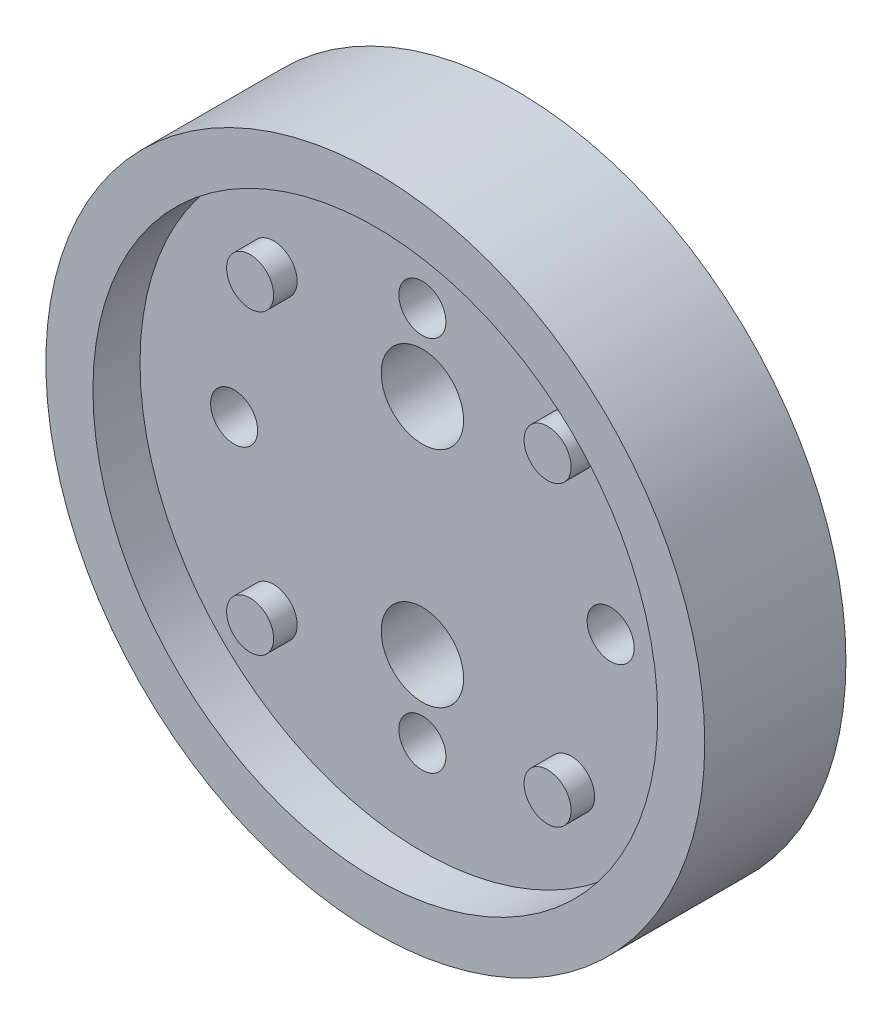
ISO-10303-21;
HEADER;
FILE_DESCRIPTION(('STEP AP214'),'2;1');
FILE_NAME('part.step','',(''),(''),'','','');
FILE_SCHEMA(('AUTOMOTIVE_DESIGN { 1 0 10303 214 1 1 1 1 }'));
ENDSEC;
DATA;
#1=APPLICATION_CONTEXT('core data for automotive mechanical design processes');
#2=APPLICATION_PROTOCOL_DEFINITION('international standard','automotive_design',2000,#1);
#3=PRODUCT_CONTEXT('',#1,'mechanical');
#4=PRODUCT('Part','Part','',(#3));
#5=PRODUCT_RELATED_PRODUCT_CATEGORY('part','',(#4));
#6=PRODUCT_DEFINITION_FORMATION('','',#4);
#7=PRODUCT_DEFINITION_CONTEXT('part definition',#1,'design');
#8=PRODUCT_DEFINITION('design','',#6,#7);
#9=PRODUCT_DEFINITION_SHAPE('','',#8);
#10=(LENGTH_UNIT() NAMED_UNIT(*) SI_UNIT(.MILLI.,.METRE.));
#11=(NAMED_UNIT(*) PLANE_ANGLE_UNIT() SI_UNIT($,.RADIAN.));
#12=(NAMED_UNIT(*) SI_UNIT($,.STERADIAN.) SOLID_ANGLE_UNIT());
#13=UNCERTAINTY_MEASURE_WITH_UNIT(LENGTH_MEASURE(1.E-05),#10,'distance_accuracy_value','');
#14=(GEOMETRIC_REPRESENTATION_CONTEXT(3) GLOBAL_UNCERTAINTY_ASSIGNED_CONTEXT((#13)) GLOBAL_UNIT_ASSIGNED_CONTEXT((#10,
#11,#12)) REPRESENTATION_CONTEXT('',''));
#15=CARTESIAN_POINT('',(0.,0.,0.));
#16=DIRECTION('',(0.,0.,1.));
#17=DIRECTION('',(1.,0.,0.));
#18=AXIS2_PLACEMENT_3D('',#15,#16,#17);
#19=CARTESIAN_POINT('',(0.,0.,4.));
#20=DIRECTION('',(0.,0.,1.));
#21=DIRECTION('',(1.,0.,0.));
#22=AXIS2_PLACEMENT_3D('',#19,#20,#21);
#23=PLANE('',#22);
#24=CARTESIAN_POINT('',(6.32077084341238,6.32077084341231,4.));
#25=DIRECTION('',(0.,0.,1.));
#26=DIRECTION('',(1.,0.,0.));
#27=AXIS2_PLACEMENT_3D('',#24,#25,#26);
#28=CIRCLE('',#27,0.999999999999999);
#29=CARTESIAN_POINT('',(7.32077084341238,6.32077084341231,4.));
#30=VERTEX_POINT('',#29);
#31=EDGE_CURVE('E102',#30,#30,#28,.T.);
#32=ORIENTED_EDGE('',*,*,#31,.F.);
#33=EDGE_LOOP('',(#32));
#34=FACE_BOUND('',#33,.T.);
#35=CARTESIAN_POINT('',(-6.32077084341233,-6.32077084341236,4.));
#36=DIRECTION('',(0.,0.,1.));
#37=DIRECTION('',(1.,0.,0.));
#38=AXIS2_PLACEMENT_3D('',#35,#36,#37);
#39=CIRCLE('',#38,1.);
#40=CARTESIAN_POINT('',(-5.32077084341233,-6.32077084341236,4.));
#41=VERTEX_POINT('',#40);
#42=EDGE_CURVE('E90',#41,#41,#39,.T.);
#43=ORIENTED_EDGE('',*,*,#42,.F.);
#44=EDGE_LOOP('',(#43));
#45=FACE_BOUND('',#44,.T.);
#46=CARTESIAN_POINT('',(0.,-4.75,4.));
#47=DIRECTION('',(0.,0.,1.));
#48=DIRECTION('',(1.,0.,0.));
#49=AXIS2_PLACEMENT_3D('',#46,#47,#48);
#50=CIRCLE('',#49,1.75);
#51=CARTESIAN_POINT('',(1.75,-4.75,4.));
#52=VERTEX_POINT('',#51);
#53=EDGE_CURVE('E84',#52,#52,#50,.T.);
#54=ORIENTED_EDGE('',*,*,#53,.F.);
#55=EDGE_LOOP('',(#54));
#56=FACE_BOUND('',#55,.T.);
#57=CARTESIAN_POINT('',(0.,4.75,4.));
#58=DIRECTION('',(0.,0.,1.));
#59=DIRECTION('',(1.,0.,0.));
#60=AXIS2_PLACEMENT_3D('',#57,#58,#59);
#61=CIRCLE('',#60,1.75);
#62=CARTESIAN_POINT('',(1.75,4.75,4.));
#63=VERTEX_POINT('',#62);
#64=EDGE_CURVE('E78',#63,#63,#61,.T.);
#65=ORIENTED_EDGE('',*,*,#64,.F.);
#66=EDGE_LOOP('',(#65));
#67=FACE_BOUND('',#66,.T.);
#68=CARTESIAN_POINT('',(-8.,0.,4.));
#69=DIRECTION('',(0.,0.,1.));
#70=DIRECTION('',(1.,0.,0.));
#71=AXIS2_PLACEMENT_3D('',#68,#69,#70);
#72=CIRCLE('',#71,1.);
#73=CARTESIAN_POINT('',(-7.,0.,4.));
#74=VERTEX_POINT('',#73);
#75=EDGE_CURVE('E72',#74,#74,#72,.T.);
#76=ORIENTED_EDGE('',*,*,#75,.F.);
#77=EDGE_LOOP('',(#76));
#78=FACE_BOUND('',#77,.T.);
#79=CARTESIAN_POINT('',(0.,-8.,4.));
#80=DIRECTION('',(0.,0.,1.));
#81=DIRECTION('',(1.,0.,0.));
#82=AXIS2_PLACEMENT_3D('',#79,#80,#81);
#83=CIRCLE('',#82,1.);
#84=CARTESIAN_POINT('',(1.,-8.,4.));
#85=VERTEX_POINT('',#84);
#86=EDGE_CURVE('E66',#85,#85,#83,.T.);
#87=ORIENTED_EDGE('',*,*,#86,.F.);
#88=EDGE_LOOP('',(#87));
#89=FACE_BOUND('',#88,.T.);
#90=CARTESIAN_POINT('',(8.,0.,4.));
#91=DIRECTION('',(0.,0.,1.));
#92=DIRECTION('',(1.,0.,0.));
#93=AXIS2_PLACEMENT_3D('',#90,#91,#92);
#94=CIRCLE('',#93,1.);
#95=CARTESIAN_POINT('',(9.,0.,4.));
#96=VERTEX_POINT('',#95);
#97=EDGE_CURVE('E60',#96,#96,#94,.T.);
#98=ORIENTED_EDGE('',*,*,#97,.F.);
#99=EDGE_LOOP('',(#98));
#100=FACE_BOUND('',#99,.T.);
#101=CARTESIAN_POINT('',(0.,8.,4.));
#102=DIRECTION('',(0.,0.,1.));
#103=DIRECTION('',(1.,0.,0.));
#104=AXIS2_PLACEMENT_3D('',#101,#102,#103);
#105=CIRCLE('',#104,1.);
#106=CARTESIAN_POINT('',(1.,8.,4.));
#107=VERTEX_POINT('',#106);
#108=EDGE_CURVE('E54',#107,#107,#105,.T.);
#109=ORIENTED_EDGE('',*,*,#108,.F.);
#110=EDGE_LOOP('',(#109));
#111=FACE_BOUND('',#110,.T.);
#112=CARTESIAN_POINT('',(0.,0.,4.));
#113=DIRECTION('',(0.,0.,1.));
#114=DIRECTION('',(1.,0.,0.));
#115=AXIS2_PLACEMENT_3D('',#112,#113,#114);
#116=CIRCLE('',#115,12.);
#117=CARTESIAN_POINT('',(12.,0.,4.));
#118=VERTEX_POINT('',#117);
#119=EDGE_CURVE('E10',#118,#118,#116,.F.);
#120=ORIENTED_EDGE('',*,*,#119,.F.);
#121=EDGE_LOOP('',(#120));
#122=FACE_BOUND('',#121,.T.);
#123=CARTESIAN_POINT('',(-6.32077084341234,6.32077084341236,4.));
#124=DIRECTION('',(0.,0.,1.));
#125=DIRECTION('',(1.,0.,0.));
#126=AXIS2_PLACEMENT_3D('',#123,#124,#125);
#127=CIRCLE('',#126,1.);
#128=CARTESIAN_POINT('',(-5.32077084341234,6.32077084341236,4.));
#129=VERTEX_POINT('',#128);
#130=EDGE_CURVE('E96',#129,#129,#127,.T.);
#131=ORIENTED_EDGE('',*,*,#130,.F.);
#132=EDGE_LOOP('',(#131));
#133=FACE_BOUND('',#132,.T.);
#134=CARTESIAN_POINT('',(6.3207708434123,-6.3207708434124,4.));
#135=DIRECTION('',(0.,0.,1.));
#136=DIRECTION('',(1.,0.,0.));
#137=AXIS2_PLACEMENT_3D('',#134,#135,#136);
#138=CIRCLE('',#137,0.999999999999999);
#139=CARTESIAN_POINT('',(7.32077084341229,-6.3207708434124,4.));
#140=VERTEX_POINT('',#139);
#141=EDGE_CURVE('E108',#140,#140,#138,.T.);
#142=ORIENTED_EDGE('',*,*,#141,.F.);
#143=EDGE_LOOP('',(#142));
#144=FACE_BOUND('',#143,.T.);
#145=ADVANCED_FACE('F33',(#34,#45,#56,#67,#78,#89,#100,#111,#122,#133,#144),#23,.T.);
#146=CARTESIAN_POINT('',(0.,0.,4.));
#147=DIRECTION('',(0.,0.,-1.));
#148=DIRECTION('',(-1.,0.,0.));
#149=AXIS2_PLACEMENT_3D('',#146,#147,#148);
#150=CYLINDRICAL_SURFACE('',#149,14.);
#151=CARTESIAN_POINT('',(0.,0.,0.));
#152=DIRECTION('',(0.,0.,1.));
#153=DIRECTION('',(1.,0.,0.));
#154=AXIS2_PLACEMENT_3D('',#151,#152,#153);
#155=CIRCLE('',#154,14.);
#156=CARTESIAN_POINT('',(14.,0.,0.));
#157=VERTEX_POINT('',#156);
#158=EDGE_CURVE('E40',#157,#157,#155,.T.);
#159=ORIENTED_EDGE('',*,*,#158,.T.);
#160=EDGE_LOOP('',(#159));
#161=FACE_BOUND('',#160,.T.);
#162=CARTESIAN_POINT('',(0.,0.,6.));
#163=DIRECTION('',(0.,0.,1.));
#164=DIRECTION('',(1.,0.,0.));
#165=AXIS2_PLACEMENT_3D('',#162,#163,#164);
#166=CIRCLE('',#165,14.);
#167=CARTESIAN_POINT('',(14.,0.,6.));
#168=VERTEX_POINT('',#167);
#169=EDGE_CURVE('E44',#168,#168,#166,.T.);
#170=ORIENTED_EDGE('',*,*,#169,.F.);
#171=EDGE_LOOP('',(#170));
#172=FACE_BOUND('',#171,.T.);
#173=ADVANCED_FACE('F35',(#161,#172),#150,.T.);
#174=CARTESIAN_POINT('',(0.,0.,0.));
#175=DIRECTION('',(0.,0.,1.));
#176=DIRECTION('',(1.,0.,0.));
#177=AXIS2_PLACEMENT_3D('',#174,#175,#176);
#178=PLANE('',#177);
#179=CARTESIAN_POINT('',(0.,-4.75,0.));
#180=DIRECTION('',(0.,0.,1.));
#181=DIRECTION('',(1.,0.,0.));
#182=AXIS2_PLACEMENT_3D('',#179,#180,#181);
#183=CIRCLE('',#182,1.75);
#184=CARTESIAN_POINT('',(1.75,-4.75,0.));
#185=VERTEX_POINT('',#184);
#186=EDGE_CURVE('E81',#185,#185,#183,.T.);
#187=ORIENTED_EDGE('',*,*,#186,.T.);
#188=EDGE_LOOP('',(#187));
#189=FACE_BOUND('',#188,.T.);
#190=CARTESIAN_POINT('',(0.,4.75,0.));
#191=DIRECTION('',(0.,0.,1.));
#192=DIRECTION('',(1.,0.,0.));
#193=AXIS2_PLACEMENT_3D('',#190,#191,#192);
#194=CIRCLE('',#193,1.75);
#195=CARTESIAN_POINT('',(1.75,4.75,0.));
#196=VERTEX_POINT('',#195);
#197=EDGE_CURVE('E75',#196,#196,#194,.T.);
#198=ORIENTED_EDGE('',*,*,#197,.T.);
#199=EDGE_LOOP('',(#198));
#200=FACE_BOUND('',#199,.T.);
#201=CARTESIAN_POINT('',(-8.,0.,0.));
#202=DIRECTION('',(0.,0.,1.));
#203=DIRECTION('',(1.,0.,0.));
#204=AXIS2_PLACEMENT_3D('',#201,#202,#203);
#205=CIRCLE('',#204,1.);
#206=CARTESIAN_POINT('',(-7.,0.,0.));
#207=VERTEX_POINT('',#206);
#208=EDGE_CURVE('E69',#207,#207,#205,.T.);
#209=ORIENTED_EDGE('',*,*,#208,.T.);
#210=EDGE_LOOP('',(#209));
#211=FACE_BOUND('',#210,.T.);
#212=CARTESIAN_POINT('',(0.,-8.,0.));
#213=DIRECTION('',(0.,0.,1.));
#214=DIRECTION('',(1.,0.,0.));
#215=AXIS2_PLACEMENT_3D('',#212,#213,#214);
#216=CIRCLE('',#215,1.);
#217=CARTESIAN_POINT('',(1.,-8.,0.));
#218=VERTEX_POINT('',#217);
#219=EDGE_CURVE('E63',#218,#218,#216,.T.);
#220=ORIENTED_EDGE('',*,*,#219,.T.);
#221=EDGE_LOOP('',(#220));
#222=FACE_BOUND('',#221,.T.);
#223=CARTESIAN_POINT('',(8.,0.,0.));
#224=DIRECTION('',(0.,0.,1.));
#225=DIRECTION('',(1.,0.,0.));
#226=AXIS2_PLACEMENT_3D('',#223,#224,#225);
#227=CIRCLE('',#226,1.);
#228=CARTESIAN_POINT('',(9.,0.,0.));
#229=VERTEX_POINT('',#228);
#230=EDGE_CURVE('E57',#229,#229,#227,.T.);
#231=ORIENTED_EDGE('',*,*,#230,.T.);
#232=EDGE_LOOP('',(#231));
#233=FACE_BOUND('',#232,.T.);
#234=CARTESIAN_POINT('',(0.,8.,0.));
#235=DIRECTION('',(0.,0.,1.));
#236=DIRECTION('',(1.,0.,0.));
#237=AXIS2_PLACEMENT_3D('',#234,#235,#236);
#238=CIRCLE('',#237,1.);
#239=CARTESIAN_POINT('',(1.,8.,0.));
#240=VERTEX_POINT('',#239);
#241=EDGE_CURVE('E53',#240,#240,#238,.T.);
#242=ORIENTED_EDGE('',*,*,#241,.T.);
#243=EDGE_LOOP('',(#242));
#244=FACE_BOUND('',#243,.T.);
#245=ORIENTED_EDGE('',*,*,#158,.F.);
#246=EDGE_LOOP('',(#245));
#247=FACE_BOUND('',#246,.T.);
#248=ADVANCED_FACE('F129',(#189,#200,#211,#222,#233,#244,#247),#178,.F.);
#249=CARTESIAN_POINT('',(0.,0.,6.));
#250=DIRECTION('',(0.,0.,1.));
#251=DIRECTION('',(1.,0.,0.));
#252=AXIS2_PLACEMENT_3D('',#249,#250,#251);
#253=PLANE('',#252);
#254=ORIENTED_EDGE('',*,*,#169,.T.);
#255=EDGE_LOOP('',(#254));
#256=FACE_BOUND('',#255,.T.);
#257=CARTESIAN_POINT('',(0.,0.,6.));
#258=DIRECTION('',(0.,0.,1.));
#259=DIRECTION('',(1.,0.,0.));
#260=AXIS2_PLACEMENT_3D('',#257,#258,#259);
#261=CIRCLE('',#260,12.);
#262=CARTESIAN_POINT('',(12.,0.,6.));
#263=VERTEX_POINT('',#262);
#264=EDGE_CURVE('E48',#263,#263,#261,.T.);
#265=ORIENTED_EDGE('',*,*,#264,.F.);
#266=EDGE_LOOP('',(#265));
#267=FACE_BOUND('',#266,.T.);
#268=ADVANCED_FACE('F133',(#256,#267),#253,.T.);
#269=CARTESIAN_POINT('',(0.,0.,6.));
#270=DIRECTION('',(0.,0.,-1.));
#271=DIRECTION('',(-1.,0.,0.));
#272=AXIS2_PLACEMENT_3D('',#269,#270,#271);
#273=CYLINDRICAL_SURFACE('',#272,12.);
#274=ORIENTED_EDGE('',*,*,#264,.T.);
#275=EDGE_LOOP('',(#274));
#276=FACE_BOUND('',#275,.T.);
#277=ORIENTED_EDGE('',*,*,#119,.T.);
#278=EDGE_LOOP('',(#277));
#279=FACE_BOUND('',#278,.T.);
#280=ADVANCED_FACE('F140',(#276,#279),#273,.F.);
#281=CARTESIAN_POINT('',(0.,8.,0.));
#282=DIRECTION('',(0.,0.,1.));
#283=DIRECTION('',(1.,0.,0.));
#284=AXIS2_PLACEMENT_3D('',#281,#282,#283);
#285=CYLINDRICAL_SURFACE('',#284,1.);
#286=ORIENTED_EDGE('',*,*,#241,.F.);
#287=EDGE_LOOP('',(#286));
#288=FACE_BOUND('',#287,.T.);
#289=ORIENTED_EDGE('',*,*,#108,.T.);
#290=EDGE_LOOP('',(#289));
#291=FACE_BOUND('',#290,.T.);
#292=ADVANCED_FACE('F155',(#288,#291),#285,.F.);
#293=CARTESIAN_POINT('',(8.,0.,0.));
#294=DIRECTION('',(0.,0.,1.));
#295=DIRECTION('',(1.,0.,0.));
#296=AXIS2_PLACEMENT_3D('',#293,#294,#295);
#297=CYLINDRICAL_SURFACE('',#296,1.);
#298=ORIENTED_EDGE('',*,*,#230,.F.);
#299=EDGE_LOOP('',(#298));
#300=FACE_BOUND('',#299,.T.);
#301=ORIENTED_EDGE('',*,*,#97,.T.);
#302=EDGE_LOOP('',(#301));
#303=FACE_BOUND('',#302,.T.);
#304=ADVANCED_FACE('F158',(#300,#303),#297,.F.);
#305=CARTESIAN_POINT('',(0.,-8.,0.));
#306=DIRECTION('',(0.,0.,1.));
#307=DIRECTION('',(1.,0.,0.));
#308=AXIS2_PLACEMENT_3D('',#305,#306,#307);
#309=CYLINDRICAL_SURFACE('',#308,1.);
#310=ORIENTED_EDGE('',*,*,#219,.F.);
#311=EDGE_LOOP('',(#310));
#312=FACE_BOUND('',#311,.T.);
#313=ORIENTED_EDGE('',*,*,#86,.T.);
#314=EDGE_LOOP('',(#313));
#315=FACE_BOUND('',#314,.T.);
#316=ADVANCED_FACE('F199',(#312,#315),#309,.F.);
#317=CARTESIAN_POINT('',(-8.,0.,0.));
#318=DIRECTION('',(0.,0.,1.));
#319=DIRECTION('',(1.,0.,0.));
#320=AXIS2_PLACEMENT_3D('',#317,#318,#319);
#321=CYLINDRICAL_SURFACE('',#320,1.);
#322=ORIENTED_EDGE('',*,*,#208,.F.);
#323=EDGE_LOOP('',(#322));
#324=FACE_BOUND('',#323,.T.);
#325=ORIENTED_EDGE('',*,*,#75,.T.);
#326=EDGE_LOOP('',(#325));
#327=FACE_BOUND('',#326,.T.);
#328=ADVANCED_FACE('F195',(#324,#327),#321,.F.);
#329=CARTESIAN_POINT('',(0.,4.75,0.));
#330=DIRECTION('',(0.,0.,1.));
#331=DIRECTION('',(1.,0.,0.));
#332=AXIS2_PLACEMENT_3D('',#329,#330,#331);
#333=CYLINDRICAL_SURFACE('',#332,1.75);
#334=ORIENTED_EDGE('',*,*,#197,.F.);
#335=EDGE_LOOP('',(#334));
#336=FACE_BOUND('',#335,.T.);
#337=ORIENTED_EDGE('',*,*,#64,.T.);
#338=EDGE_LOOP('',(#337));
#339=FACE_BOUND('',#338,.T.);
#340=ADVANCED_FACE('F191',(#336,#339),#333,.F.);
#341=CARTESIAN_POINT('',(0.,-4.75,0.));
#342=DIRECTION('',(0.,0.,1.));
#343=DIRECTION('',(1.,0.,0.));
#344=AXIS2_PLACEMENT_3D('',#341,#342,#343);
#345=CYLINDRICAL_SURFACE('',#344,1.75);
#346=ORIENTED_EDGE('',*,*,#186,.F.);
#347=EDGE_LOOP('',(#346));
#348=FACE_BOUND('',#347,.T.);
#349=ORIENTED_EDGE('',*,*,#53,.T.);
#350=EDGE_LOOP('',(#349));
#351=FACE_BOUND('',#350,.T.);
#352=ADVANCED_FACE('F187',(#348,#351),#345,.F.);
#353=CARTESIAN_POINT('',(-6.32077084341233,-6.32077084341236,5.));
#354=DIRECTION('',(0.,0.,-1.));
#355=DIRECTION('',(-1.,0.,0.));
#356=AXIS2_PLACEMENT_3D('',#353,#354,#355);
#357=CYLINDRICAL_SURFACE('',#356,1.);
#358=CARTESIAN_POINT('',(-6.32077084341233,-6.32077084341236,5.));
#359=DIRECTION('',(0.,0.,1.));
#360=DIRECTION('',(1.,0.,0.));
#361=AXIS2_PLACEMENT_3D('',#358,#359,#360);
#362=CIRCLE('',#361,1.);
#363=CARTESIAN_POINT('',(-5.32077084341233,-6.32077084341236,5.));
#364=VERTEX_POINT('',#363);
#365=EDGE_CURVE('E87',#364,#364,#362,.T.);
#366=ORIENTED_EDGE('',*,*,#365,.F.);
#367=EDGE_LOOP('',(#366));
#368=FACE_BOUND('',#367,.T.);
#369=ORIENTED_EDGE('',*,*,#42,.T.);
#370=EDGE_LOOP('',(#369));
#371=FACE_BOUND('',#370,.T.);
#372=ADVANCED_FACE('F179',(#368,#371),#357,.T.);
#373=CARTESIAN_POINT('',(-6.32077084341233,-6.32077084341236,5.));
#374=DIRECTION('',(0.,0.,1.));
#375=DIRECTION('',(1.,0.,0.));
#376=AXIS2_PLACEMENT_3D('',#373,#374,#375);
#377=PLANE('',#376);
#378=ORIENTED_EDGE('',*,*,#365,.T.);
#379=EDGE_LOOP('',(#378));
#380=FACE_BOUND('',#379,.T.);
#381=ADVANCED_FACE('F169',(#380),#377,.T.);
#382=CARTESIAN_POINT('',(-6.32077084341234,6.32077084341236,5.));
#383=DIRECTION('',(0.,0.,-1.));
#384=DIRECTION('',(-1.,0.,0.));
#385=AXIS2_PLACEMENT_3D('',#382,#383,#384);
#386=CYLINDRICAL_SURFACE('',#385,1.);
#387=CARTESIAN_POINT('',(-6.32077084341234,6.32077084341236,5.));
#388=DIRECTION('',(0.,0.,1.));
#389=DIRECTION('',(1.,0.,0.));
#390=AXIS2_PLACEMENT_3D('',#387,#388,#389);
#391=CIRCLE('',#390,1.);
#392=CARTESIAN_POINT('',(-5.32077084341234,6.32077084341236,5.));
#393=VERTEX_POINT('',#392);
#394=EDGE_CURVE('E93',#393,#393,#391,.T.);
#395=ORIENTED_EDGE('',*,*,#394,.F.);
#396=EDGE_LOOP('',(#395));
#397=FACE_BOUND('',#396,.T.);
#398=ORIENTED_EDGE('',*,*,#130,.T.);
#399=EDGE_LOOP('',(#398));
#400=FACE_BOUND('',#399,.T.);
#401=ADVANCED_FACE('F166',(#397,#400),#386,.T.);
#402=CARTESIAN_POINT('',(-6.32077084341234,6.32077084341236,5.));
#403=DIRECTION('',(0.,0.,1.));
#404=DIRECTION('',(1.,0.,0.));
#405=AXIS2_PLACEMENT_3D('',#402,#403,#404);
#406=PLANE('',#405);
#407=ORIENTED_EDGE('',*,*,#394,.T.);
#408=EDGE_LOOP('',(#407));
#409=FACE_BOUND('',#408,.T.);
#410=ADVANCED_FACE('F168',(#409),#406,.T.);
#411=CARTESIAN_POINT('',(6.32077084341238,6.32077084341231,5.));
#412=DIRECTION('',(0.,0.,-1.));
#413=DIRECTION('',(-1.,0.,0.));
#414=AXIS2_PLACEMENT_3D('',#411,#412,#413);
#415=CYLINDRICAL_SURFACE('',#414,0.999999999999999);
#416=CARTESIAN_POINT('',(6.32077084341238,6.32077084341231,5.));
#417=DIRECTION('',(0.,0.,1.));
#418=DIRECTION('',(1.,0.,0.));
#419=AXIS2_PLACEMENT_3D('',#416,#417,#418);
#420=CIRCLE('',#419,0.999999999999999);
#421=CARTESIAN_POINT('',(7.32077084341238,6.32077084341231,5.));
#422=VERTEX_POINT('',#421);
#423=EDGE_CURVE('E99',#422,#422,#420,.T.);
#424=ORIENTED_EDGE('',*,*,#423,.F.);
#425=EDGE_LOOP('',(#424));
#426=FACE_BOUND('',#425,.T.);
#427=ORIENTED_EDGE('',*,*,#31,.T.);
#428=EDGE_LOOP('',(#427));
#429=FACE_BOUND('',#428,.T.);
#430=ADVANCED_FACE('F176',(#426,#429),#415,.T.);
#431=CARTESIAN_POINT('',(6.32077084341238,6.32077084341231,5.));
#432=DIRECTION('',(0.,0.,1.));
#433=DIRECTION('',(1.,0.,0.));
#434=AXIS2_PLACEMENT_3D('',#431,#432,#433);
#435=PLANE('',#434);
#436=ORIENTED_EDGE('',*,*,#423,.T.);
#437=EDGE_LOOP('',(#436));
#438=FACE_BOUND('',#437,.T.);
#439=ADVANCED_FACE('F119',(#438),#435,.T.);
#440=CARTESIAN_POINT('',(6.3207708434123,-6.3207708434124,5.));
#441=DIRECTION('',(0.,0.,-1.));
#442=DIRECTION('',(-1.,0.,0.));
#443=AXIS2_PLACEMENT_3D('',#440,#441,#442);
#444=CYLINDRICAL_SURFACE('',#443,0.999999999999999);
#445=CARTESIAN_POINT('',(6.3207708434123,-6.3207708434124,5.));
#446=DIRECTION('',(0.,0.,1.));
#447=DIRECTION('',(1.,0.,0.));
#448=AXIS2_PLACEMENT_3D('',#445,#446,#447);
#449=CIRCLE('',#448,0.999999999999999);
#450=CARTESIAN_POINT('',(7.32077084341229,-6.3207708434124,5.));
#451=VERTEX_POINT('',#450);
#452=EDGE_CURVE('E105',#451,#451,#449,.T.);
#453=ORIENTED_EDGE('',*,*,#452,.F.);
#454=EDGE_LOOP('',(#453));
#455=FACE_BOUND('',#454,.T.);
#456=ORIENTED_EDGE('',*,*,#141,.T.);
#457=EDGE_LOOP('',(#456));
#458=FACE_BOUND('',#457,.T.);
#459=ADVANCED_FACE('F116',(#455,#458),#444,.T.);
#460=CARTESIAN_POINT('',(6.3207708434123,-6.3207708434124,5.));
#461=DIRECTION('',(0.,0.,1.));
#462=DIRECTION('',(1.,0.,0.));
#463=AXIS2_PLACEMENT_3D('',#460,#461,#462);
#464=PLANE('',#463);
#465=ORIENTED_EDGE('',*,*,#452,.T.);
#466=EDGE_LOOP('',(#465));
#467=FACE_BOUND('',#466,.T.);
#468=ADVANCED_FACE('F114',(#467),#464,.T.);
#469=CLOSED_SHELL('',(#145,#173,#248,#268,#280,#292,#304,#316,#328,#340,#352,#372,#381,#401,
#410,#430,#439,#459,#468));
#470=MANIFOLD_SOLID_BREP('B2',#469);
#471=ADVANCED_BREP_SHAPE_REPRESENTATION('',(#18,#470),#14);
#472=SHAPE_DEFINITION_REPRESENTATION(#9,#471);
ENDSEC;
END-ISO-10303-21;
